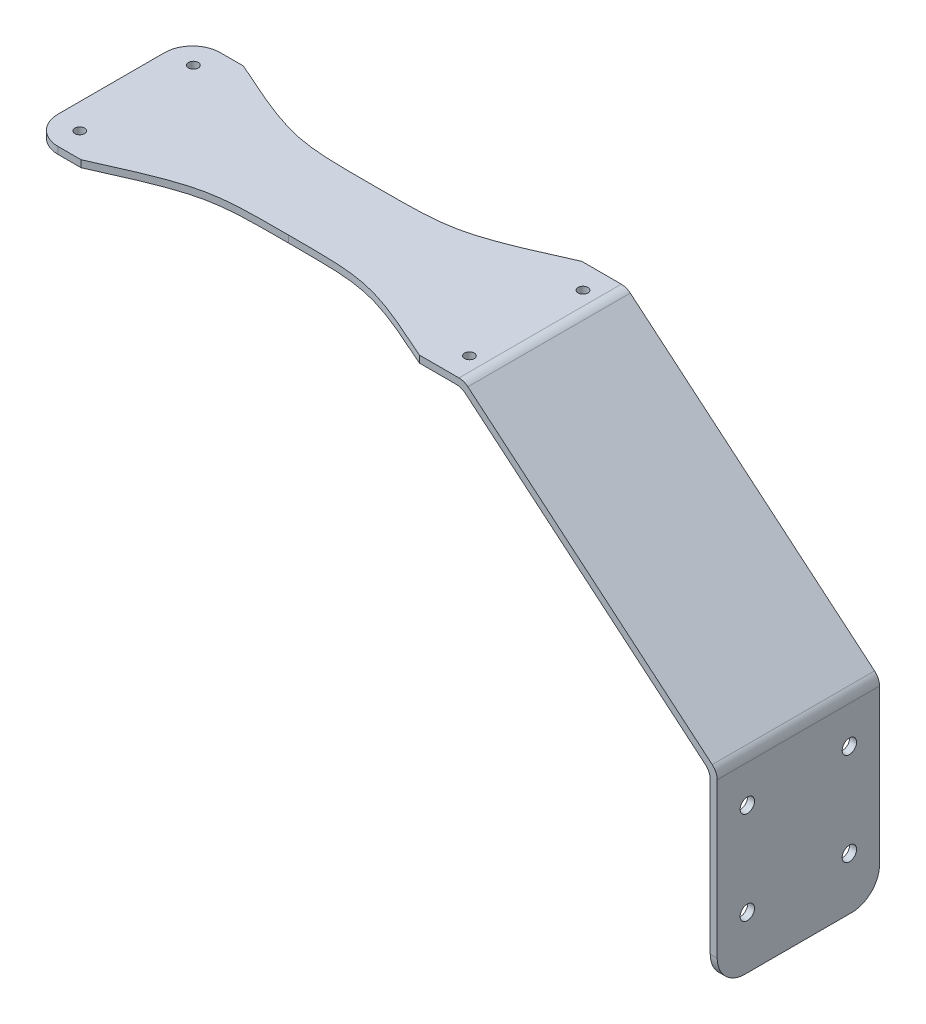
ISO-10303-21;
HEADER;
FILE_DESCRIPTION(('STEP AP214'),'2;1');
FILE_NAME('part.step','',(''),(''),'','','');
FILE_SCHEMA(('AUTOMOTIVE_DESIGN { 1 0 10303 214 1 1 1 1 }'));
ENDSEC;
DATA;
#1=APPLICATION_CONTEXT('core data for automotive mechanical design processes');
#2=APPLICATION_PROTOCOL_DEFINITION('international standard','automotive_design',2000,#1);
#3=PRODUCT_CONTEXT('',#1,'mechanical');
#4=PRODUCT('Part','Part','',(#3));
#5=PRODUCT_RELATED_PRODUCT_CATEGORY('part','',(#4));
#6=PRODUCT_DEFINITION_FORMATION('','',#4);
#7=PRODUCT_DEFINITION_CONTEXT('part definition',#1,'design');
#8=PRODUCT_DEFINITION('design','',#6,#7);
#9=PRODUCT_DEFINITION_SHAPE('','',#8);
#10=(LENGTH_UNIT() NAMED_UNIT(*) SI_UNIT(.MILLI.,.METRE.));
#11=(NAMED_UNIT(*) PLANE_ANGLE_UNIT() SI_UNIT($,.RADIAN.));
#12=(NAMED_UNIT(*) SI_UNIT($,.STERADIAN.) SOLID_ANGLE_UNIT());
#13=UNCERTAINTY_MEASURE_WITH_UNIT(LENGTH_MEASURE(1.E-05),#10,'distance_accuracy_value','');
#14=(GEOMETRIC_REPRESENTATION_CONTEXT(3) GLOBAL_UNCERTAINTY_ASSIGNED_CONTEXT((#13)) GLOBAL_UNIT_ASSIGNED_CONTEXT((#10,
#11,#12)) REPRESENTATION_CONTEXT('',''));
#15=CARTESIAN_POINT('',(0.,0.,0.));
#16=DIRECTION('',(0.,0.,1.));
#17=DIRECTION('',(1.,0.,0.));
#18=AXIS2_PLACEMENT_3D('',#15,#16,#17);
#19=CARTESIAN_POINT('',(-82.9491352286368,46.9727212743943,35.));
#20=DIRECTION('',(0.,-1.,0.));
#21=DIRECTION('',(1.,0.,0.));
#22=AXIS2_PLACEMENT_3D('',#19,#20,#21);
#23=PLANE('',#22);
#24=CARTESIAN_POINT('',(-77.4950905800361,46.9727212743943,5.25));
#25=DIRECTION('',(0.,1.,0.));
#26=DIRECTION('',(0.,0.,1.));
#27=AXIS2_PLACEMENT_3D('',#24,#25,#26);
#28=CIRCLE('',#27,1.05);
#29=CARTESIAN_POINT('',(-77.4950905800361,46.9727212743943,6.3));
#30=VERTEX_POINT('',#29);
#31=EDGE_CURVE('E487',#30,#30,#28,.T.);
#32=ORIENTED_EDGE('',*,*,#31,.F.);
#33=EDGE_LOOP('',(#32));
#34=FACE_BOUND('',#33,.T.);
#35=CARTESIAN_POINT('',(-77.4950905800361,46.9727212743943,29.75));
#36=DIRECTION('',(0.,1.,0.));
#37=DIRECTION('',(0.,0.,1.));
#38=AXIS2_PLACEMENT_3D('',#35,#36,#37);
#39=CIRCLE('',#38,1.05);
#40=CARTESIAN_POINT('',(-77.4950905800361,46.9727212743943,30.8));
#41=VERTEX_POINT('',#40);
#42=EDGE_CURVE('E481',#41,#41,#39,.T.);
#43=ORIENTED_EDGE('',*,*,#42,.F.);
#44=EDGE_LOOP('',(#43));
#45=FACE_BOUND('',#44,.T.);
#46=CARTESIAN_POINT('',(6.50490941996386,46.9727212743943,5.25));
#47=DIRECTION('',(0.,1.,0.));
#48=DIRECTION('',(0.,0.,1.));
#49=AXIS2_PLACEMENT_3D('',#46,#47,#48);
#50=CIRCLE('',#49,1.04999999999999);
#51=CARTESIAN_POINT('',(6.50490941996386,46.9727212743943,6.29999999999999));
#52=VERTEX_POINT('',#51);
#53=EDGE_CURVE('E475',#52,#52,#50,.T.);
#54=ORIENTED_EDGE('',*,*,#53,.F.);
#55=EDGE_LOOP('',(#54));
#56=FACE_BOUND('',#55,.T.);
#57=CARTESIAN_POINT('',(6.50490941996386,46.9727212743943,29.75));
#58=DIRECTION('',(0.,1.,0.));
#59=DIRECTION('',(0.,0.,1.));
#60=AXIS2_PLACEMENT_3D('',#57,#58,#59);
#61=CIRCLE('',#60,1.04999999999999);
#62=CARTESIAN_POINT('',(6.50490941996386,46.9727212743943,30.8));
#63=VERTEX_POINT('',#62);
#64=EDGE_CURVE('E469',#63,#63,#61,.T.);
#65=ORIENTED_EDGE('',*,*,#64,.F.);
#66=EDGE_LOOP('',(#65));
#67=FACE_BOUND('',#66,.T.);
#68=DIRECTION('',(0.,0.,-1.));
#69=VECTOR('',#68,1.);
#70=CARTESIAN_POINT('',(-82.9491352286368,46.9727212743943,35.));
#71=LINE('',#70,#69);
#72=CARTESIAN_POINT('',(-82.9491352286368,46.9727212743943,29.));
#73=VERTEX_POINT('',#72);
#74=CARTESIAN_POINT('',(-82.9491352286368,46.9727212743943,6.));
#75=VERTEX_POINT('',#74);
#76=EDGE_CURVE('E421',#73,#75,#71,.T.);
#77=ORIENTED_EDGE('',*,*,#76,.F.);
#78=CARTESIAN_POINT('',(-76.9491352286368,46.9727212743943,29.));
#79=DIRECTION('',(0.,-1.,0.));
#80=DIRECTION('',(1.,0.,0.));
#81=AXIS2_PLACEMENT_3D('',#78,#79,#80);
#82=CIRCLE('',#81,6.);
#83=CARTESIAN_POINT('',(-76.9491352286368,46.9727212743943,35.));
#84=VERTEX_POINT('',#83);
#85=EDGE_CURVE('E43',#73,#84,#82,.F.);
#86=ORIENTED_EDGE('',*,*,#85,.T.);
#87=DIRECTION('',(-1.,0.,0.));
#88=VECTOR('',#87,1.);
#89=CARTESIAN_POINT('',(-82.9491352286368,46.9727212743943,35.));
#90=LINE('',#89,#88);
#91=CARTESIAN_POINT('',(-71.981048338657,46.9727212743943,34.9999999994622));
#92=VERTEX_POINT('',#91);
#93=EDGE_CURVE('E208',#92,#84,#90,.T.);
#94=ORIENTED_EDGE('',*,*,#93,.F.);
#95=CARTESIAN_POINT('',(-77.4950905800361,46.9727212743943,37.5024454575796));
#96=CARTESIAN_POINT('',(-53.569935160438,46.9727212743943,26.6142980217504));
#97=CARTESIAN_POINT('',(-53.5142664198541,46.9727212743943,26.6999776009493));
#98=CARTESIAN_POINT('',(-35.4950905800361,46.9727212743943,26.6999776009493));
#99=B_SPLINE_CURVE_WITH_KNOTS('',3,(#95,#96,#97,#98),.UNSPECIFIED.,.F.,.F.,(4,4),(0.,1.),.UNSPECIFIED.);
#100=CARTESIAN_POINT('',(-35.4950905800362,46.9727212743943,26.6999776009493));
#101=VERTEX_POINT('',#100);
#102=EDGE_CURVE('E189',#92,#101,#99,.T.);
#103=ORIENTED_EDGE('',*,*,#102,.T.);
#104=CARTESIAN_POINT('',(6.50490941996383,46.9727212743943,37.5024454575796));
#105=CARTESIAN_POINT('',(-17.4202459996343,46.9727212743943,26.6142980217504));
#106=CARTESIAN_POINT('',(-17.4759147402182,46.9727212743943,26.6999776009493));
#107=CARTESIAN_POINT('',(-35.4950905800361,46.9727212743943,26.6999776009493));
#108=B_SPLINE_CURVE_WITH_KNOTS('',3,(#104,#105,#106,#107),.UNSPECIFIED.,.F.,.F.,(4,4),(0.,1.),.UNSPECIFIED.);
#109=CARTESIAN_POINT('',(0.990867178584706,46.9727212743943,34.9999999994622));
#110=VERTEX_POINT('',#109);
#111=EDGE_CURVE('E198',#110,#101,#108,.T.);
#112=ORIENTED_EDGE('',*,*,#111,.F.);
#113=CARTESIAN_POINT('',(9.50490941996389,46.9727212743943,35.));
#114=VERTEX_POINT('',#113);
#115=EDGE_CURVE('E463',#114,#110,#90,.T.);
#116=ORIENTED_EDGE('',*,*,#115,.F.);
#117=DIRECTION('',(0.,0.,-1.));
#118=VECTOR('',#117,1.);
#119=CARTESIAN_POINT('',(9.50490941996389,46.9727212743943,35.));
#120=LINE('',#119,#118);
#121=CARTESIAN_POINT('',(9.50490941996389,46.9727212743943,0.));
#122=VERTEX_POINT('',#121);
#123=EDGE_CURVE('E393',#114,#122,#120,.T.);
#124=ORIENTED_EDGE('',*,*,#123,.T.);
#125=DIRECTION('',(-1.,0.,0.));
#126=VECTOR('',#125,1.);
#127=CARTESIAN_POINT('',(-82.9491352286368,46.9727212743943,0.));
#128=LINE('',#127,#126);
#129=CARTESIAN_POINT('',(0.990867178584714,46.9727212743943,5.37825101294687E-10));
#130=VERTEX_POINT('',#129);
#131=EDGE_CURVE('E445',#122,#130,#128,.T.);
#132=ORIENTED_EDGE('',*,*,#131,.T.);
#133=CARTESIAN_POINT('',(6.50490941996383,46.9727212743943,-2.50244545757964));
#134=CARTESIAN_POINT('',(-17.4202459996343,46.9727212743943,8.38570197824956));
#135=CARTESIAN_POINT('',(-17.4759147402182,46.9727212743943,8.30002239905066));
#136=CARTESIAN_POINT('',(-35.4950905800361,46.9727212743943,8.30002239905066));
#137=B_SPLINE_CURVE_WITH_KNOTS('',3,(#133,#134,#135,#136),.UNSPECIFIED.,.F.,.F.,(4,4),(0.,1.),.UNSPECIFIED.);
#138=CARTESIAN_POINT('',(-35.4950905800362,46.9727212743943,8.30002239905066));
#139=VERTEX_POINT('',#138);
#140=EDGE_CURVE('E228',#130,#139,#137,.T.);
#141=ORIENTED_EDGE('',*,*,#140,.T.);
#142=CARTESIAN_POINT('',(-77.4950905800361,46.9727212743943,-2.50244545757964));
#143=CARTESIAN_POINT('',(-53.569935160438,46.9727212743943,8.38570197824956));
#144=CARTESIAN_POINT('',(-53.5142664198541,46.9727212743943,8.30002239905066));
#145=CARTESIAN_POINT('',(-35.4950905800361,46.9727212743943,8.30002239905066));
#146=B_SPLINE_CURVE_WITH_KNOTS('',3,(#142,#143,#144,#145),.UNSPECIFIED.,.F.,.F.,(4,4),(0.,1.),.UNSPECIFIED.);
#147=CARTESIAN_POINT('',(-71.981048338657,46.9727212743943,5.37825101294687E-10));
#148=VERTEX_POINT('',#147);
#149=EDGE_CURVE('E507',#148,#139,#146,.T.);
#150=ORIENTED_EDGE('',*,*,#149,.F.);
#151=CARTESIAN_POINT('',(-76.9491352286368,46.9727212743943,0.));
#152=VERTEX_POINT('',#151);
#153=EDGE_CURVE('E448',#148,#152,#128,.T.);
#154=ORIENTED_EDGE('',*,*,#153,.T.);
#155=CARTESIAN_POINT('',(-76.9491352286368,46.9727212743943,6.));
#156=DIRECTION('',(0.,-1.,0.));
#157=DIRECTION('',(1.,0.,0.));
#158=AXIS2_PLACEMENT_3D('',#155,#156,#157);
#159=CIRCLE('',#158,6.);
#160=EDGE_CURVE('E55',#152,#75,#159,.F.);
#161=ORIENTED_EDGE('',*,*,#160,.T.);
#162=EDGE_LOOP('',(#77,#86,#94,#103,#112,#116,#124,#132,#141,#150,#154,#161));
#163=FACE_BOUND('',#162,.T.);
#164=ADVANCED_FACE('F35',(#34,#45,#56,#67,#163),#23,.F.);
#165=CARTESIAN_POINT('',(10.0508647713632,45.4727212743943,35.));
#166=DIRECTION('',(0.,1.,0.));
#167=DIRECTION('',(-1.,0.,0.));
#168=AXIS2_PLACEMENT_3D('',#165,#166,#167);
#169=PLANE('',#168);
#170=CARTESIAN_POINT('',(-77.4950905800361,45.4727212743943,5.25));
#171=DIRECTION('',(0.,1.,0.));
#172=DIRECTION('',(-1.,0.,0.));
#173=AXIS2_PLACEMENT_3D('',#170,#171,#172);
#174=CIRCLE('',#173,1.05);
#175=CARTESIAN_POINT('',(-78.5450905800361,45.4727212743943,5.25));
#176=VERTEX_POINT('',#175);
#177=EDGE_CURVE('E484',#176,#176,#174,.T.);
#178=ORIENTED_EDGE('',*,*,#177,.T.);
#179=EDGE_LOOP('',(#178));
#180=FACE_BOUND('',#179,.T.);
#181=CARTESIAN_POINT('',(-77.4950905800361,45.4727212743943,29.75));
#182=DIRECTION('',(0.,1.,0.));
#183=DIRECTION('',(-1.,0.,0.));
#184=AXIS2_PLACEMENT_3D('',#181,#182,#183);
#185=CIRCLE('',#184,1.05);
#186=CARTESIAN_POINT('',(-78.5450905800361,45.4727212743943,29.75));
#187=VERTEX_POINT('',#186);
#188=EDGE_CURVE('E478',#187,#187,#185,.T.);
#189=ORIENTED_EDGE('',*,*,#188,.T.);
#190=EDGE_LOOP('',(#189));
#191=FACE_BOUND('',#190,.T.);
#192=CARTESIAN_POINT('',(6.50490941996386,45.4727212743943,5.25));
#193=DIRECTION('',(0.,1.,0.));
#194=DIRECTION('',(-1.,0.,0.));
#195=AXIS2_PLACEMENT_3D('',#192,#193,#194);
#196=CIRCLE('',#195,1.04999999999999);
#197=CARTESIAN_POINT('',(5.45490941996387,45.4727212743943,5.25));
#198=VERTEX_POINT('',#197);
#199=EDGE_CURVE('E472',#198,#198,#196,.T.);
#200=ORIENTED_EDGE('',*,*,#199,.T.);
#201=EDGE_LOOP('',(#200));
#202=FACE_BOUND('',#201,.T.);
#203=CARTESIAN_POINT('',(6.50490941996386,45.4727212743943,29.75));
#204=DIRECTION('',(0.,1.,0.));
#205=DIRECTION('',(-1.,0.,0.));
#206=AXIS2_PLACEMENT_3D('',#203,#204,#205);
#207=CIRCLE('',#206,1.04999999999999);
#208=CARTESIAN_POINT('',(5.45490941996387,45.4727212743943,29.75));
#209=VERTEX_POINT('',#208);
#210=EDGE_CURVE('E452',#209,#209,#207,.T.);
#211=ORIENTED_EDGE('',*,*,#210,.T.);
#212=EDGE_LOOP('',(#211));
#213=FACE_BOUND('',#212,.T.);
#214=DIRECTION('',(1.,0.,0.));
#215=VECTOR('',#214,1.);
#216=CARTESIAN_POINT('',(10.0508647713632,45.4727212743943,35.));
#217=LINE('',#216,#215);
#218=CARTESIAN_POINT('',(-76.9491352286368,45.4727212743943,35.));
#219=VERTEX_POINT('',#218);
#220=CARTESIAN_POINT('',(-71.9810483398484,45.4727212743943,35.));
#221=VERTEX_POINT('',#220);
#222=EDGE_CURVE('E460',#219,#221,#217,.T.);
#223=ORIENTED_EDGE('',*,*,#222,.F.);
#224=CARTESIAN_POINT('',(-76.9491352286368,45.4727212743943,29.));
#225=DIRECTION('',(0.,1.,0.));
#226=DIRECTION('',(-1.,0.,0.));
#227=AXIS2_PLACEMENT_3D('',#224,#225,#226);
#228=CIRCLE('',#227,6.);
#229=CARTESIAN_POINT('',(-82.9491352286368,45.4727212743943,29.));
#230=VERTEX_POINT('',#229);
#231=EDGE_CURVE('E350',#219,#230,#228,.F.);
#232=ORIENTED_EDGE('',*,*,#231,.T.);
#233=DIRECTION('',(0.,0.,-1.));
#234=VECTOR('',#233,1.);
#235=CARTESIAN_POINT('',(-82.9491352286368,45.4727212743943,35.));
#236=LINE('',#235,#234);
#237=CARTESIAN_POINT('',(-82.9491352286368,45.4727212743943,6.));
#238=VERTEX_POINT('',#237);
#239=EDGE_CURVE('E423',#230,#238,#236,.T.);
#240=ORIENTED_EDGE('',*,*,#239,.T.);
#241=CARTESIAN_POINT('',(-76.9491352286368,45.4727212743943,6.));
#242=DIRECTION('',(0.,1.,0.));
#243=DIRECTION('',(-1.,0.,0.));
#244=AXIS2_PLACEMENT_3D('',#241,#242,#243);
#245=CIRCLE('',#244,6.);
#246=CARTESIAN_POINT('',(-76.9491352286368,45.4727212743943,0.));
#247=VERTEX_POINT('',#246);
#248=EDGE_CURVE('E352',#238,#247,#245,.F.);
#249=ORIENTED_EDGE('',*,*,#248,.T.);
#250=DIRECTION('',(1.,0.,0.));
#251=VECTOR('',#250,1.);
#252=CARTESIAN_POINT('',(10.0508647713632,45.4727212743943,0.));
#253=LINE('',#252,#251);
#254=CARTESIAN_POINT('',(-71.9810483398484,45.4727212743943,0.));
#255=VERTEX_POINT('',#254);
#256=EDGE_CURVE('E442',#247,#255,#253,.T.);
#257=ORIENTED_EDGE('',*,*,#256,.T.);
#258=CARTESIAN_POINT('',(-77.4950905800361,45.4727212743943,-2.50244545757964));
#259=CARTESIAN_POINT('',(-53.569935160438,45.4727212743943,8.38570197824956));
#260=CARTESIAN_POINT('',(-53.5142664198541,45.4727212743943,8.30002239905066));
#261=CARTESIAN_POINT('',(-35.4950905800361,45.4727212743943,8.30002239905066));
#262=B_SPLINE_CURVE_WITH_KNOTS('',3,(#258,#259,#260,#261),.UNSPECIFIED.,.F.,.F.,(4,4),(0.,1.),.UNSPECIFIED.);
#263=CARTESIAN_POINT('',(-35.4950905800362,45.4727212743943,8.30002239905066));
#264=VERTEX_POINT('',#263);
#265=EDGE_CURVE('E494',#255,#264,#262,.T.);
#266=ORIENTED_EDGE('',*,*,#265,.T.);
#267=CARTESIAN_POINT('',(6.50490941996383,45.4727212743943,-2.50244545757964));
#268=CARTESIAN_POINT('',(-17.4202459996343,45.4727212743943,8.38570197824956));
#269=CARTESIAN_POINT('',(-17.4759147402182,45.4727212743943,8.30002239905066));
#270=CARTESIAN_POINT('',(-35.4950905800361,45.4727212743943,8.30002239905066));
#271=B_SPLINE_CURVE_WITH_KNOTS('',3,(#267,#268,#269,#270),.UNSPECIFIED.,.F.,.F.,(4,4),(0.,1.),.UNSPECIFIED.);
#272=CARTESIAN_POINT('',(0.990867179776089,45.4727212743943,0.));
#273=VERTEX_POINT('',#272);
#274=EDGE_CURVE('E490',#273,#264,#271,.T.);
#275=ORIENTED_EDGE('',*,*,#274,.F.);
#276=CARTESIAN_POINT('',(8.95895406856458,45.4727212743943,0.));
#277=VERTEX_POINT('',#276);
#278=EDGE_CURVE('E444',#273,#277,#253,.T.);
#279=ORIENTED_EDGE('',*,*,#278,.T.);
#280=DIRECTION('',(0.,0.,-1.));
#281=VECTOR('',#280,1.);
#282=CARTESIAN_POINT('',(8.95895406856458,45.4727212743943,35.));
#283=LINE('',#282,#281);
#284=CARTESIAN_POINT('',(8.95895406856458,45.4727212743943,35.));
#285=VERTEX_POINT('',#284);
#286=EDGE_CURVE('E390',#277,#285,#283,.F.);
#287=ORIENTED_EDGE('',*,*,#286,.T.);
#288=CARTESIAN_POINT('',(0.990867179776077,45.4727212743943,35.));
#289=VERTEX_POINT('',#288);
#290=EDGE_CURVE('E462',#289,#285,#217,.T.);
#291=ORIENTED_EDGE('',*,*,#290,.F.);
#292=CARTESIAN_POINT('',(6.50490941996383,45.4727212743943,37.5024454575796));
#293=CARTESIAN_POINT('',(-17.4202459996343,45.4727212743943,26.6142980217504));
#294=CARTESIAN_POINT('',(-17.4759147402182,45.4727212743943,26.6999776009493));
#295=CARTESIAN_POINT('',(-35.4950905800361,45.4727212743943,26.6999776009493));
#296=B_SPLINE_CURVE_WITH_KNOTS('',3,(#292,#293,#294,#295),.UNSPECIFIED.,.F.,.F.,(4,4),(0.,1.),.UNSPECIFIED.);
#297=CARTESIAN_POINT('',(-35.4950905800362,45.4727212743943,26.6999776009493));
#298=VERTEX_POINT('',#297);
#299=EDGE_CURVE('E195',#289,#298,#296,.T.);
#300=ORIENTED_EDGE('',*,*,#299,.T.);
#301=CARTESIAN_POINT('',(-77.4950905800361,45.4727212743943,37.5024454575796));
#302=CARTESIAN_POINT('',(-53.569935160438,45.4727212743943,26.6142980217504));
#303=CARTESIAN_POINT('',(-53.5142664198541,45.4727212743943,26.6999776009493));
#304=CARTESIAN_POINT('',(-35.4950905800361,45.4727212743943,26.6999776009493));
#305=B_SPLINE_CURVE_WITH_KNOTS('',3,(#301,#302,#303,#304),.UNSPECIFIED.,.F.,.F.,(4,4),(0.,1.),.UNSPECIFIED.);
#306=EDGE_CURVE('E192',#221,#298,#305,.T.);
#307=ORIENTED_EDGE('',*,*,#306,.F.);
#308=EDGE_LOOP('',(#223,#232,#240,#249,#257,#266,#275,#279,#287,#291,#300,#307));
#309=FACE_BOUND('',#308,.T.);
#310=ADVANCED_FACE('F295',(#180,#191,#202,#213,#309),#169,.F.);
#311=CARTESIAN_POINT('',(0.,0.,35.));
#312=DIRECTION('',(0.,0.,1.));
#313=DIRECTION('',(1.,0.,0.));
#314=AXIS2_PLACEMENT_3D('',#311,#312,#313);
#315=PLANE('',#314);
#316=ORIENTED_EDGE('',*,*,#93,.T.);
#317=DIRECTION('',(0.,-1.,0.));
#318=VECTOR('',#317,1.);
#319=CARTESIAN_POINT('',(-76.9491352286368,45.4727212743943,35.));
#320=LINE('',#319,#318);
#321=EDGE_CURVE('E343',#84,#219,#320,.T.);
#322=ORIENTED_EDGE('',*,*,#321,.T.);
#323=ORIENTED_EDGE('',*,*,#222,.T.);
#324=DIRECTION('',(0.,1.,0.));
#325=VECTOR('',#324,1.);
#326=CARTESIAN_POINT('',(-71.9810483398484,6.97272127439429,35.));
#327=LINE('',#326,#325);
#328=EDGE_CURVE('E373',#221,#92,#327,.T.);
#329=ORIENTED_EDGE('',*,*,#328,.T.);
#330=EDGE_LOOP('',(#316,#322,#323,#329));
#331=FACE_BOUND('',#330,.T.);
#332=ADVANCED_FACE('F274',(#331),#315,.T.);
#333=CARTESIAN_POINT('',(0.,0.,0.));
#334=DIRECTION('',(0.,0.,1.));
#335=DIRECTION('',(1.,0.,0.));
#336=AXIS2_PLACEMENT_3D('',#333,#334,#335);
#337=PLANE('',#336);
#338=DIRECTION('',(0.,1.,0.));
#339=VECTOR('',#338,1.);
#340=CARTESIAN_POINT('',(65.1739757896914,-39.5224114036637,0.));
#341=LINE('',#340,#339);
#342=CARTESIAN_POINT('',(65.1739757896914,-33.5224114036637,0.));
#343=VERTEX_POINT('',#342);
#344=CARTESIAN_POINT('',(65.1739757896915,-0.221872890896202,0.));
#345=VERTEX_POINT('',#344);
#346=EDGE_CURVE('E433',#343,#345,#341,.T.);
#347=ORIENTED_EDGE('',*,*,#346,.F.);
#348=DIRECTION('',(1.,0.,0.));
#349=VECTOR('',#348,1.);
#350=CARTESIAN_POINT('',(0.,-33.5224114036637,0.));
#351=LINE('',#350,#349);
#352=CARTESIAN_POINT('',(63.6739757896914,-33.5224114036637,0.));
#353=VERTEX_POINT('',#352);
#354=EDGE_CURVE('E355',#343,#353,#351,.F.);
#355=ORIENTED_EDGE('',*,*,#354,.T.);
#356=DIRECTION('',(0.,-1.,0.));
#357=VECTOR('',#356,1.);
#358=CARTESIAN_POINT('',(63.6739757896914,0.477588596336311,0.));
#359=LINE('',#358,#357);
#360=CARTESIAN_POINT('',(63.6739757896914,-0.921334378128675,0.));
#361=VERTEX_POINT('',#360);
#362=EDGE_CURVE('E436',#361,#353,#359,.T.);
#363=ORIENTED_EDGE('',*,*,#362,.F.);
#364=CARTESIAN_POINT('',(60.6739757896914,-0.921334378128674,0.));
#365=DIRECTION('',(0.,0.,1.));
#366=DIRECTION('',(1.,0.,0.));
#367=AXIS2_PLACEMENT_3D('',#364,#365,#366);
#368=CIRCLE('',#367,3.);
#369=CARTESIAN_POINT('',(62.6023386187511,1.37679895122825,0.));
#370=VERTEX_POINT('',#369);
#371=EDGE_CURVE('E388',#361,#370,#368,.T.);
#372=ORIENTED_EDGE('',*,*,#371,.T.);
#373=DIRECTION('',(0.766044443118975,-0.642787609686543,0.));
#374=VECTOR('',#373,1.);
#375=CARTESIAN_POINT('',(63.6739757896914,0.477588596336311,0.));
#376=LINE('',#375,#374);
#377=CARTESIAN_POINT('',(10.8873168976242,44.7708546037512,0.));
#378=VERTEX_POINT('',#377);
#379=EDGE_CURVE('E439',#378,#370,#376,.T.);
#380=ORIENTED_EDGE('',*,*,#379,.F.);
#381=CARTESIAN_POINT('',(8.95895406856458,42.4727212743943,0.));
#382=DIRECTION('',(0.,0.,1.));
#383=DIRECTION('',(1.,0.,0.));
#384=AXIS2_PLACEMENT_3D('',#381,#382,#383);
#385=CIRCLE('',#384,3.);
#386=EDGE_CURVE('E383',#378,#277,#385,.T.);
#387=ORIENTED_EDGE('',*,*,#386,.T.);
#388=ORIENTED_EDGE('',*,*,#278,.F.);
#389=DIRECTION('',(0.,1.,0.));
#390=VECTOR('',#389,1.);
#391=CARTESIAN_POINT('',(0.990867179776092,6.97272127439431,0.));
#392=LINE('',#391,#390);
#393=EDGE_CURVE('E376',#130,#273,#392,.F.);
#394=ORIENTED_EDGE('',*,*,#393,.F.);
#395=ORIENTED_EDGE('',*,*,#131,.F.);
#396=CARTESIAN_POINT('',(9.50490941996389,43.9727212743943,0.));
#397=DIRECTION('',(0.,0.,1.));
#398=DIRECTION('',(1.,0.,0.));
#399=AXIS2_PLACEMENT_3D('',#396,#397,#398);
#400=CIRCLE('',#399,3.);
#401=CARTESIAN_POINT('',(11.4332722490235,46.2708546037512,0.));
#402=VERTEX_POINT('',#401);
#403=EDGE_CURVE('E406',#122,#402,#400,.F.);
#404=ORIENTED_EDGE('',*,*,#403,.T.);
#405=DIRECTION('',(-0.766044443118975,0.642787609686543,0.));
#406=VECTOR('',#405,1.);
#407=CARTESIAN_POINT('',(10.5968201227625,46.9727212743943,0.));
#408=LINE('',#407,#406);
#409=CARTESIAN_POINT('',(64.1023386187511,2.07626043846072,0.));
#410=VERTEX_POINT('',#409);
#411=EDGE_CURVE('E449',#410,#402,#408,.T.);
#412=ORIENTED_EDGE('',*,*,#411,.F.);
#413=CARTESIAN_POINT('',(62.1739757896915,-0.221872890896202,0.));
#414=DIRECTION('',(0.,0.,1.));
#415=DIRECTION('',(1.,0.,0.));
#416=AXIS2_PLACEMENT_3D('',#413,#414,#415);
#417=CIRCLE('',#416,3.);
#418=EDGE_CURVE('E403',#410,#345,#417,.F.);
#419=ORIENTED_EDGE('',*,*,#418,.T.);
#420=EDGE_LOOP('',(#347,#355,#363,#372,#380,#387,#388,#394,#395,#404,#412,#419));
#421=FACE_BOUND('',#420,.T.);
#422=ADVANCED_FACE('F278',(#421),#337,.F.);
#423=CARTESIAN_POINT('',(10.5968201227625,46.9727212743943,35.));
#424=DIRECTION('',(-0.642787609686543,-0.766044443118975,0.));
#425=DIRECTION('',(0.766044443118975,-0.642787609686543,0.));
#426=AXIS2_PLACEMENT_3D('',#423,#424,#425);
#427=PLANE('',#426);
#428=DIRECTION('',(-0.766044443118975,0.642787609686543,0.));
#429=VECTOR('',#428,1.);
#430=CARTESIAN_POINT('',(10.5968201227625,46.9727212743943,35.));
#431=LINE('',#430,#429);
#432=CARTESIAN_POINT('',(64.1023386187511,2.07626043846072,35.));
#433=VERTEX_POINT('',#432);
#434=CARTESIAN_POINT('',(11.4332722490235,46.2708546037512,35.));
#435=VERTEX_POINT('',#434);
#436=EDGE_CURVE('E435',#433,#435,#431,.T.);
#437=ORIENTED_EDGE('',*,*,#436,.F.);
#438=DIRECTION('',(0.,0.,-1.));
#439=VECTOR('',#438,1.);
#440=CARTESIAN_POINT('',(64.1023386187511,2.07626043846072,35.));
#441=LINE('',#440,#439);
#442=EDGE_CURVE('E408',#433,#410,#441,.T.);
#443=ORIENTED_EDGE('',*,*,#442,.T.);
#444=ORIENTED_EDGE('',*,*,#411,.T.);
#445=DIRECTION('',(0.,0.,-1.));
#446=VECTOR('',#445,1.);
#447=CARTESIAN_POINT('',(11.4332722490235,46.2708546037512,35.));
#448=LINE('',#447,#446);
#449=EDGE_CURVE('E411',#402,#435,#448,.F.);
#450=ORIENTED_EDGE('',*,*,#449,.T.);
#451=EDGE_LOOP('',(#437,#443,#444,#450));
#452=FACE_BOUND('',#451,.T.);
#453=ADVANCED_FACE('F301',(#452),#427,.F.);
#454=CARTESIAN_POINT('',(-82.9491352286368,45.4727212743943,35.));
#455=DIRECTION('',(1.,0.,0.));
#456=DIRECTION('',(0.,0.,-1.));
#457=AXIS2_PLACEMENT_3D('',#454,#455,#456);
#458=PLANE('',#457);
#459=ORIENTED_EDGE('',*,*,#239,.F.);
#460=DIRECTION('',(0.,-1.,0.));
#461=VECTOR('',#460,1.);
#462=CARTESIAN_POINT('',(-82.9491352286368,46.9727212743943,29.));
#463=LINE('',#462,#461);
#464=EDGE_CURVE('E341',#230,#73,#463,.F.);
#465=ORIENTED_EDGE('',*,*,#464,.T.);
#466=ORIENTED_EDGE('',*,*,#76,.T.);
#467=DIRECTION('',(0.,-1.,0.));
#468=VECTOR('',#467,1.);
#469=CARTESIAN_POINT('',(-82.9491352286368,45.4727212743943,6.));
#470=LINE('',#469,#468);
#471=EDGE_CURVE('E347',#75,#238,#470,.T.);
#472=ORIENTED_EDGE('',*,*,#471,.T.);
#473=EDGE_LOOP('',(#459,#465,#466,#472));
#474=FACE_BOUND('',#473,.T.);
#475=ADVANCED_FACE('F293',(#474),#458,.F.);
#476=CARTESIAN_POINT('',(63.6739757896914,0.477588596336311,35.));
#477=DIRECTION('',(0.642787609686543,0.766044443118975,0.));
#478=DIRECTION('',(-0.766044443118975,0.642787609686543,0.));
#479=AXIS2_PLACEMENT_3D('',#476,#477,#478);
#480=PLANE('',#479);
#481=ORIENTED_EDGE('',*,*,#379,.T.);
#482=DIRECTION('',(0.,0.,-1.));
#483=VECTOR('',#482,1.);
#484=CARTESIAN_POINT('',(62.6023386187511,1.37679895122825,35.));
#485=LINE('',#484,#483);
#486=CARTESIAN_POINT('',(62.6023386187511,1.37679895122825,35.));
#487=VERTEX_POINT('',#486);
#488=EDGE_CURVE('E413',#370,#487,#485,.F.);
#489=ORIENTED_EDGE('',*,*,#488,.T.);
#490=DIRECTION('',(0.766044443118975,-0.642787609686543,0.));
#491=VECTOR('',#490,1.);
#492=CARTESIAN_POINT('',(63.6739757896914,0.477588596336311,35.));
#493=LINE('',#492,#491);
#494=CARTESIAN_POINT('',(10.8873168976242,44.7708546037512,35.));
#495=VERTEX_POINT('',#494);
#496=EDGE_CURVE('E457',#495,#487,#493,.T.);
#497=ORIENTED_EDGE('',*,*,#496,.F.);
#498=DIRECTION('',(0.,0.,-1.));
#499=VECTOR('',#498,1.);
#500=CARTESIAN_POINT('',(10.8873168976242,44.7708546037512,0.));
#501=LINE('',#500,#499);
#502=EDGE_CURVE('E415',#495,#378,#501,.T.);
#503=ORIENTED_EDGE('',*,*,#502,.T.);
#504=EDGE_LOOP('',(#481,#489,#497,#503));
#505=FACE_BOUND('',#504,.T.);
#506=ADVANCED_FACE('F289',(#505),#480,.F.);
#507=CARTESIAN_POINT('',(63.6739757896914,0.477588596336311,35.));
#508=DIRECTION('',(1.,0.,0.));
#509=DIRECTION('',(0.,1.,0.));
#510=AXIS2_PLACEMENT_3D('',#507,#508,#509);
#511=PLANE('',#510);
#512=CARTESIAN_POINT('',(63.6739757896914,-8.22187289089621,28.5));
#513=DIRECTION('',(1.,0.,0.));
#514=DIRECTION('',(0.,1.,0.));
#515=AXIS2_PLACEMENT_3D('',#512,#513,#514);
#516=CIRCLE('',#515,1.55);
#517=CARTESIAN_POINT('',(63.6739757896914,-6.67187289089621,28.5));
#518=VERTEX_POINT('',#517);
#519=EDGE_CURVE('E809',#518,#518,#516,.T.);
#520=ORIENTED_EDGE('',*,*,#519,.T.);
#521=EDGE_LOOP('',(#520));
#522=FACE_BOUND('',#521,.T.);
#523=CARTESIAN_POINT('',(63.6739757896914,-8.22187289089621,6.5));
#524=DIRECTION('',(1.,0.,0.));
#525=DIRECTION('',(0.,1.,0.));
#526=AXIS2_PLACEMENT_3D('',#523,#524,#525);
#527=CIRCLE('',#526,1.55);
#528=CARTESIAN_POINT('',(63.6739757896914,-6.67187289089621,6.5));
#529=VERTEX_POINT('',#528);
#530=EDGE_CURVE('E803',#529,#529,#527,.T.);
#531=ORIENTED_EDGE('',*,*,#530,.T.);
#532=EDGE_LOOP('',(#531));
#533=FACE_BOUND('',#532,.T.);
#534=CARTESIAN_POINT('',(63.6739757896914,-28.2218728908962,6.5));
#535=DIRECTION('',(1.,0.,0.));
#536=DIRECTION('',(0.,1.,0.));
#537=AXIS2_PLACEMENT_3D('',#534,#535,#536);
#538=CIRCLE('',#537,1.55);
#539=CARTESIAN_POINT('',(63.6739757896914,-26.6718728908962,6.5));
#540=VERTEX_POINT('',#539);
#541=EDGE_CURVE('E797',#540,#540,#538,.T.);
#542=ORIENTED_EDGE('',*,*,#541,.T.);
#543=EDGE_LOOP('',(#542));
#544=FACE_BOUND('',#543,.T.);
#545=CARTESIAN_POINT('',(63.6739757896914,-28.2218728908962,28.5));
#546=DIRECTION('',(1.,0.,0.));
#547=DIRECTION('',(0.,1.,0.));
#548=AXIS2_PLACEMENT_3D('',#545,#546,#547);
#549=CIRCLE('',#548,1.55);
#550=CARTESIAN_POINT('',(63.6739757896914,-26.6718728908962,28.5));
#551=VERTEX_POINT('',#550);
#552=EDGE_CURVE('E204',#551,#551,#549,.T.);
#553=ORIENTED_EDGE('',*,*,#552,.T.);
#554=EDGE_LOOP('',(#553));
#555=FACE_BOUND('',#554,.T.);
#556=DIRECTION('',(0.,0.,-1.));
#557=VECTOR('',#556,1.);
#558=CARTESIAN_POINT('',(63.6739757896914,-39.5224114036637,35.));
#559=LINE('',#558,#557);
#560=CARTESIAN_POINT('',(63.6739757896914,-39.5224114036637,29.));
#561=VERTEX_POINT('',#560);
#562=CARTESIAN_POINT('',(63.6739757896914,-39.5224114036637,6.));
#563=VERTEX_POINT('',#562);
#564=EDGE_CURVE('E426',#561,#563,#559,.T.);
#565=ORIENTED_EDGE('',*,*,#564,.F.);
#566=CARTESIAN_POINT('',(63.6739757896914,-33.5224114036637,29.));
#567=DIRECTION('',(1.,0.,0.));
#568=DIRECTION('',(0.,1.,0.));
#569=AXIS2_PLACEMENT_3D('',#566,#567,#568);
#570=CIRCLE('',#569,6.);
#571=CARTESIAN_POINT('',(63.6739757896914,-33.5224114036637,35.));
#572=VERTEX_POINT('',#571);
#573=EDGE_CURVE('E357',#561,#572,#570,.F.);
#574=ORIENTED_EDGE('',*,*,#573,.T.);
#575=DIRECTION('',(0.,-1.,0.));
#576=VECTOR('',#575,1.);
#577=CARTESIAN_POINT('',(63.6739757896914,0.477588596336311,35.));
#578=LINE('',#577,#576);
#579=CARTESIAN_POINT('',(63.6739757896914,-0.921334378128675,35.));
#580=VERTEX_POINT('',#579);
#581=EDGE_CURVE('E454',#580,#572,#578,.T.);
#582=ORIENTED_EDGE('',*,*,#581,.F.);
#583=DIRECTION('',(0.,0.,-1.));
#584=VECTOR('',#583,1.);
#585=CARTESIAN_POINT('',(63.6739757896914,-0.921334378128675,0.));
#586=LINE('',#585,#584);
#587=EDGE_CURVE('E418',#580,#361,#586,.T.);
#588=ORIENTED_EDGE('',*,*,#587,.T.);
#589=ORIENTED_EDGE('',*,*,#362,.T.);
#590=CARTESIAN_POINT('',(63.6739757896914,-33.5224114036637,6.));
#591=DIRECTION('',(1.,0.,0.));
#592=DIRECTION('',(0.,1.,0.));
#593=AXIS2_PLACEMENT_3D('',#590,#591,#592);
#594=CIRCLE('',#593,6.);
#595=EDGE_CURVE('E359',#353,#563,#594,.F.);
#596=ORIENTED_EDGE('',*,*,#595,.T.);
#597=EDGE_LOOP('',(#565,#574,#582,#588,#589,#596));
#598=FACE_BOUND('',#597,.T.);
#599=ADVANCED_FACE('F285',(#522,#533,#544,#555,#598),#511,.F.);
#600=CARTESIAN_POINT('',(63.6739757896914,-39.5224114036637,35.));
#601=DIRECTION('',(0.,1.,0.));
#602=DIRECTION('',(0.,0.,1.));
#603=AXIS2_PLACEMENT_3D('',#600,#601,#602);
#604=PLANE('',#603);
#605=DIRECTION('',(0.,0.,-1.));
#606=VECTOR('',#605,1.);
#607=CARTESIAN_POINT('',(65.1739757896914,-39.5224114036637,35.));
#608=LINE('',#607,#606);
#609=CARTESIAN_POINT('',(65.1739757896914,-39.5224114036637,29.));
#610=VERTEX_POINT('',#609);
#611=CARTESIAN_POINT('',(65.1739757896914,-39.5224114036637,6.));
#612=VERTEX_POINT('',#611);
#613=EDGE_CURVE('E429',#610,#612,#608,.T.);
#614=ORIENTED_EDGE('',*,*,#613,.F.);
#615=DIRECTION('',(1.,0.,0.));
#616=VECTOR('',#615,1.);
#617=CARTESIAN_POINT('',(63.6739757896914,-39.5224114036637,29.));
#618=LINE('',#617,#616);
#619=EDGE_CURVE('E361',#610,#561,#618,.F.);
#620=ORIENTED_EDGE('',*,*,#619,.T.);
#621=ORIENTED_EDGE('',*,*,#564,.T.);
#622=DIRECTION('',(1.,0.,0.));
#623=VECTOR('',#622,1.);
#624=CARTESIAN_POINT('',(63.6739757896914,-39.5224114036637,6.));
#625=LINE('',#624,#623);
#626=EDGE_CURVE('E363',#563,#612,#625,.T.);
#627=ORIENTED_EDGE('',*,*,#626,.T.);
#628=EDGE_LOOP('',(#614,#620,#621,#627));
#629=FACE_BOUND('',#628,.T.);
#630=ADVANCED_FACE('F281',(#629),#604,.F.);
#631=CARTESIAN_POINT('',(65.1739757896914,-39.5224114036637,35.));
#632=DIRECTION('',(-1.,0.,0.));
#633=DIRECTION('',(0.,-1.,0.));
#634=AXIS2_PLACEMENT_3D('',#631,#632,#633);
#635=PLANE('',#634);
#636=CARTESIAN_POINT('',(65.1739757896915,-8.22187289089621,28.5));
#637=DIRECTION('',(1.,0.,0.));
#638=DIRECTION('',(0.,0.,-1.));
#639=AXIS2_PLACEMENT_3D('',#636,#637,#638);
#640=CIRCLE('',#639,1.55);
#641=CARTESIAN_POINT('',(65.1739757896915,-8.22187289089621,26.95));
#642=VERTEX_POINT('',#641);
#643=EDGE_CURVE('E812',#642,#642,#640,.T.);
#644=ORIENTED_EDGE('',*,*,#643,.F.);
#645=EDGE_LOOP('',(#644));
#646=FACE_BOUND('',#645,.T.);
#647=CARTESIAN_POINT('',(65.1739757896915,-8.22187289089621,6.5));
#648=DIRECTION('',(1.,0.,0.));
#649=DIRECTION('',(0.,0.,-1.));
#650=AXIS2_PLACEMENT_3D('',#647,#648,#649);
#651=CIRCLE('',#650,1.55);
#652=CARTESIAN_POINT('',(65.1739757896915,-8.22187289089621,4.95));
#653=VERTEX_POINT('',#652);
#654=EDGE_CURVE('E806',#653,#653,#651,.T.);
#655=ORIENTED_EDGE('',*,*,#654,.F.);
#656=EDGE_LOOP('',(#655));
#657=FACE_BOUND('',#656,.T.);
#658=CARTESIAN_POINT('',(65.1739757896915,-28.2218728908962,6.5));
#659=DIRECTION('',(1.,0.,0.));
#660=DIRECTION('',(0.,0.,-1.));
#661=AXIS2_PLACEMENT_3D('',#658,#659,#660);
#662=CIRCLE('',#661,1.55);
#663=CARTESIAN_POINT('',(65.1739757896915,-28.2218728908962,4.95));
#664=VERTEX_POINT('',#663);
#665=EDGE_CURVE('E800',#664,#664,#662,.T.);
#666=ORIENTED_EDGE('',*,*,#665,.F.);
#667=EDGE_LOOP('',(#666));
#668=FACE_BOUND('',#667,.T.);
#669=CARTESIAN_POINT('',(65.1739757896915,-28.2218728908962,28.5));
#670=DIRECTION('',(1.,0.,0.));
#671=DIRECTION('',(0.,0.,-1.));
#672=AXIS2_PLACEMENT_3D('',#669,#670,#671);
#673=CIRCLE('',#672,1.55);
#674=CARTESIAN_POINT('',(65.1739757896915,-28.2218728908962,26.95));
#675=VERTEX_POINT('',#674);
#676=EDGE_CURVE('E794',#675,#675,#673,.T.);
#677=ORIENTED_EDGE('',*,*,#676,.F.);
#678=EDGE_LOOP('',(#677));
#679=FACE_BOUND('',#678,.T.);
#680=DIRECTION('',(0.,1.,0.));
#681=VECTOR('',#680,1.);
#682=CARTESIAN_POINT('',(65.1739757896914,-39.5224114036637,35.));
#683=LINE('',#682,#681);
#684=CARTESIAN_POINT('',(65.1739757896914,-33.5224114036637,35.));
#685=VERTEX_POINT('',#684);
#686=CARTESIAN_POINT('',(65.1739757896915,-0.221872890896202,35.));
#687=VERTEX_POINT('',#686);
#688=EDGE_CURVE('E432',#685,#687,#683,.T.);
#689=ORIENTED_EDGE('',*,*,#688,.F.);
#690=CARTESIAN_POINT('',(65.1739757896914,-33.5224114036637,29.));
#691=DIRECTION('',(-1.,0.,0.));
#692=DIRECTION('',(0.,-1.,0.));
#693=AXIS2_PLACEMENT_3D('',#690,#691,#692);
#694=CIRCLE('',#693,6.);
#695=EDGE_CURVE('E366',#685,#610,#694,.F.);
#696=ORIENTED_EDGE('',*,*,#695,.T.);
#697=ORIENTED_EDGE('',*,*,#613,.T.);
#698=CARTESIAN_POINT('',(65.1739757896914,-33.5224114036637,6.));
#699=DIRECTION('',(-1.,0.,0.));
#700=DIRECTION('',(0.,-1.,0.));
#701=AXIS2_PLACEMENT_3D('',#698,#699,#700);
#702=CIRCLE('',#701,6.);
#703=EDGE_CURVE('E368',#612,#343,#702,.F.);
#704=ORIENTED_EDGE('',*,*,#703,.T.);
#705=ORIENTED_EDGE('',*,*,#346,.T.);
#706=DIRECTION('',(0.,0.,-1.));
#707=VECTOR('',#706,1.);
#708=CARTESIAN_POINT('',(65.1739757896915,-0.221872890896202,35.));
#709=LINE('',#708,#707);
#710=EDGE_CURVE('E400',#345,#687,#709,.F.);
#711=ORIENTED_EDGE('',*,*,#710,.T.);
#712=EDGE_LOOP('',(#689,#696,#697,#704,#705,#711));
#713=FACE_BOUND('',#712,.T.);
#714=ADVANCED_FACE('F272',(#646,#657,#668,#679,#713),#635,.F.);
#715=ORIENTED_EDGE('',*,*,#581,.T.);
#716=DIRECTION('',(1.,0.,0.));
#717=VECTOR('',#716,1.);
#718=CARTESIAN_POINT('',(65.1739757896914,-33.5224114036637,35.));
#719=LINE('',#718,#717);
#720=EDGE_CURVE('E370',#572,#685,#719,.T.);
#721=ORIENTED_EDGE('',*,*,#720,.T.);
#722=ORIENTED_EDGE('',*,*,#688,.T.);
#723=CARTESIAN_POINT('',(62.1739757896915,-0.221872890896202,35.));
#724=DIRECTION('',(0.,0.,1.));
#725=DIRECTION('',(1.,0.,0.));
#726=AXIS2_PLACEMENT_3D('',#723,#724,#725);
#727=CIRCLE('',#726,3.);
#728=EDGE_CURVE('E396',#687,#433,#727,.T.);
#729=ORIENTED_EDGE('',*,*,#728,.T.);
#730=ORIENTED_EDGE('',*,*,#436,.T.);
#731=CARTESIAN_POINT('',(9.50490941996389,43.9727212743943,35.));
#732=DIRECTION('',(0.,0.,1.));
#733=DIRECTION('',(1.,0.,0.));
#734=AXIS2_PLACEMENT_3D('',#731,#732,#733);
#735=CIRCLE('',#734,3.);
#736=EDGE_CURVE('E398',#435,#114,#735,.T.);
#737=ORIENTED_EDGE('',*,*,#736,.T.);
#738=ORIENTED_EDGE('',*,*,#115,.T.);
#739=DIRECTION('',(0.,1.,0.));
#740=VECTOR('',#739,1.);
#741=CARTESIAN_POINT('',(0.990867179776075,6.97272127439431,35.));
#742=LINE('',#741,#740);
#743=EDGE_CURVE('E201',#289,#110,#742,.T.);
#744=ORIENTED_EDGE('',*,*,#743,.F.);
#745=ORIENTED_EDGE('',*,*,#290,.T.);
#746=CARTESIAN_POINT('',(8.95895406856458,42.4727212743943,35.));
#747=DIRECTION('',(0.,0.,1.));
#748=DIRECTION('',(1.,0.,0.));
#749=AXIS2_PLACEMENT_3D('',#746,#747,#748);
#750=CIRCLE('',#749,3.);
#751=EDGE_CURVE('E381',#285,#495,#750,.F.);
#752=ORIENTED_EDGE('',*,*,#751,.T.);
#753=ORIENTED_EDGE('',*,*,#496,.T.);
#754=CARTESIAN_POINT('',(60.6739757896914,-0.921334378128674,35.));
#755=DIRECTION('',(0.,0.,1.));
#756=DIRECTION('',(1.,0.,0.));
#757=AXIS2_PLACEMENT_3D('',#754,#755,#756);
#758=CIRCLE('',#757,3.);
#759=EDGE_CURVE('E386',#487,#580,#758,.F.);
#760=ORIENTED_EDGE('',*,*,#759,.T.);
#761=EDGE_LOOP('',(#715,#721,#722,#729,#730,#737,#738,#744,#745,#752,#753,#760));
#762=FACE_BOUND('',#761,.T.);
#763=ADVANCED_FACE('F268',(#762),#315,.T.);
#764=ORIENTED_EDGE('',*,*,#256,.F.);
#765=DIRECTION('',(0.,-1.,0.));
#766=VECTOR('',#765,1.);
#767=CARTESIAN_POINT('',(-76.9491352286368,0.,0.));
#768=LINE('',#767,#766);
#769=EDGE_CURVE('E11',#247,#152,#768,.F.);
#770=ORIENTED_EDGE('',*,*,#769,.T.);
#771=ORIENTED_EDGE('',*,*,#153,.F.);
#772=DIRECTION('',(0.,1.,0.));
#773=VECTOR('',#772,1.);
#774=CARTESIAN_POINT('',(-71.9810483398484,6.97272127439429,0.));
#775=LINE('',#774,#773);
#776=EDGE_CURVE('E378',#148,#255,#775,.F.);
#777=ORIENTED_EDGE('',*,*,#776,.T.);
#778=EDGE_LOOP('',(#764,#770,#771,#777));
#779=FACE_BOUND('',#778,.T.);
#780=ADVANCED_FACE('F271',(#779),#337,.F.);
#781=CARTESIAN_POINT('',(60.6739757896914,-0.921334378128674,35.));
#782=DIRECTION('',(0.,0.,1.));
#783=DIRECTION('',(1.,0.,0.));
#784=AXIS2_PLACEMENT_3D('',#781,#782,#783);
#785=CYLINDRICAL_SURFACE('',#784,3.);
#786=ORIENTED_EDGE('',*,*,#759,.F.);
#787=ORIENTED_EDGE('',*,*,#488,.F.);
#788=ORIENTED_EDGE('',*,*,#371,.F.);
#789=ORIENTED_EDGE('',*,*,#587,.F.);
#790=EDGE_LOOP('',(#786,#787,#788,#789));
#791=FACE_BOUND('',#790,.T.);
#792=ADVANCED_FACE('F277',(#791),#785,.F.);
#793=CARTESIAN_POINT('',(62.1739757896915,-0.221872890896202,35.));
#794=DIRECTION('',(0.,0.,-1.));
#795=DIRECTION('',(-1.,0.,0.));
#796=AXIS2_PLACEMENT_3D('',#793,#794,#795);
#797=CYLINDRICAL_SURFACE('',#796,3.);
#798=ORIENTED_EDGE('',*,*,#728,.F.);
#799=ORIENTED_EDGE('',*,*,#710,.F.);
#800=ORIENTED_EDGE('',*,*,#418,.F.);
#801=ORIENTED_EDGE('',*,*,#442,.F.);
#802=EDGE_LOOP('',(#798,#799,#800,#801));
#803=FACE_BOUND('',#802,.T.);
#804=ADVANCED_FACE('F311',(#803),#797,.T.);
#805=CARTESIAN_POINT('',(9.50490941996389,43.9727212743943,35.));
#806=DIRECTION('',(0.,0.,-1.));
#807=DIRECTION('',(-1.,0.,0.));
#808=AXIS2_PLACEMENT_3D('',#805,#806,#807);
#809=CYLINDRICAL_SURFACE('',#808,3.);
#810=ORIENTED_EDGE('',*,*,#736,.F.);
#811=ORIENTED_EDGE('',*,*,#449,.F.);
#812=ORIENTED_EDGE('',*,*,#403,.F.);
#813=ORIENTED_EDGE('',*,*,#123,.F.);
#814=EDGE_LOOP('',(#810,#811,#812,#813));
#815=FACE_BOUND('',#814,.T.);
#816=ADVANCED_FACE('F315',(#815),#809,.T.);
#817=CARTESIAN_POINT('',(8.95895406856458,42.4727212743943,35.));
#818=DIRECTION('',(0.,0.,1.));
#819=DIRECTION('',(1.,0.,0.));
#820=AXIS2_PLACEMENT_3D('',#817,#818,#819);
#821=CYLINDRICAL_SURFACE('',#820,3.);
#822=ORIENTED_EDGE('',*,*,#751,.F.);
#823=ORIENTED_EDGE('',*,*,#286,.F.);
#824=ORIENTED_EDGE('',*,*,#386,.F.);
#825=ORIENTED_EDGE('',*,*,#502,.F.);
#826=EDGE_LOOP('',(#822,#823,#824,#825));
#827=FACE_BOUND('',#826,.T.);
#828=ADVANCED_FACE('F266',(#827),#821,.F.);
#829=CARTESIAN_POINT('',(6.50490941996386,46.9727212743943,29.75));
#830=DIRECTION('',(0.,1.,0.));
#831=DIRECTION('',(0.,0.,1.));
#832=AXIS2_PLACEMENT_3D('',#829,#830,#831);
#833=CYLINDRICAL_SURFACE('',#832,1.04999999999999);
#834=ORIENTED_EDGE('',*,*,#210,.F.);
#835=EDGE_LOOP('',(#834));
#836=FACE_BOUND('',#835,.T.);
#837=ORIENTED_EDGE('',*,*,#64,.T.);
#838=EDGE_LOOP('',(#837));
#839=FACE_BOUND('',#838,.T.);
#840=ADVANCED_FACE('F262',(#836,#839),#833,.F.);
#841=CARTESIAN_POINT('',(6.50490941996386,46.9727212743943,5.25));
#842=DIRECTION('',(0.,1.,0.));
#843=DIRECTION('',(0.,0.,1.));
#844=AXIS2_PLACEMENT_3D('',#841,#842,#843);
#845=CYLINDRICAL_SURFACE('',#844,1.04999999999999);
#846=ORIENTED_EDGE('',*,*,#199,.F.);
#847=EDGE_LOOP('',(#846));
#848=FACE_BOUND('',#847,.T.);
#849=ORIENTED_EDGE('',*,*,#53,.T.);
#850=EDGE_LOOP('',(#849));
#851=FACE_BOUND('',#850,.T.);
#852=ADVANCED_FACE('F258',(#848,#851),#845,.F.);
#853=CARTESIAN_POINT('',(-77.4950905800361,46.9727212743943,29.75));
#854=DIRECTION('',(0.,1.,0.));
#855=DIRECTION('',(0.,0.,1.));
#856=AXIS2_PLACEMENT_3D('',#853,#854,#855);
#857=CYLINDRICAL_SURFACE('',#856,1.05);
#858=ORIENTED_EDGE('',*,*,#188,.F.);
#859=EDGE_LOOP('',(#858));
#860=FACE_BOUND('',#859,.T.);
#861=ORIENTED_EDGE('',*,*,#42,.T.);
#862=EDGE_LOOP('',(#861));
#863=FACE_BOUND('',#862,.T.);
#864=ADVANCED_FACE('F254',(#860,#863),#857,.F.);
#865=CARTESIAN_POINT('',(-77.4950905800361,46.9727212743943,5.25));
#866=DIRECTION('',(0.,1.,0.));
#867=DIRECTION('',(0.,0.,1.));
#868=AXIS2_PLACEMENT_3D('',#865,#866,#867);
#869=CYLINDRICAL_SURFACE('',#868,1.05);
#870=ORIENTED_EDGE('',*,*,#177,.F.);
#871=EDGE_LOOP('',(#870));
#872=FACE_BOUND('',#871,.T.);
#873=ORIENTED_EDGE('',*,*,#31,.T.);
#874=EDGE_LOOP('',(#873));
#875=FACE_BOUND('',#874,.T.);
#876=ADVANCED_FACE('F249',(#872,#875),#869,.F.);
#877=CARTESIAN_POINT('',(6.50490941996383,6.97272127439431,-2.50244545757964));
#878=CARTESIAN_POINT('',(-17.4202459996343,6.97272127439431,8.38570197824956));
#879=CARTESIAN_POINT('',(-17.4759147402182,6.97272127439431,8.30002239905066));
#880=CARTESIAN_POINT('',(-35.4950905800361,6.97272127439431,8.30002239905066));
#881=B_SPLINE_CURVE_WITH_KNOTS('',3,(#877,#878,#879,#880),.UNSPECIFIED.,.F.,.F.,(4,4),(0.,1.),.UNSPECIFIED.);
#882=DIRECTION('',(0.,1.,0.));
#883=VECTOR('',#882,1.);
#884=SURFACE_OF_LINEAR_EXTRUSION('',#881,#883);
#885=ORIENTED_EDGE('',*,*,#274,.T.);
#886=DIRECTION('',(0.,1.,0.));
#887=VECTOR('',#886,1.);
#888=CARTESIAN_POINT('',(-35.4950905800362,6.97272127439431,8.30002239905066));
#889=LINE('',#888,#887);
#890=EDGE_CURVE('E502',#264,#139,#889,.T.);
#891=ORIENTED_EDGE('',*,*,#890,.T.);
#892=ORIENTED_EDGE('',*,*,#140,.F.);
#893=ORIENTED_EDGE('',*,*,#393,.T.);
#894=EDGE_LOOP('',(#885,#891,#892,#893));
#895=FACE_BOUND('',#894,.T.);
#896=ADVANCED_FACE('F244',(#895),#884,.T.);
#897=CARTESIAN_POINT('',(-77.4950905800361,6.97272127439429,-2.50244545757964));
#898=CARTESIAN_POINT('',(-53.569935160438,6.97272127439429,8.38570197824956));
#899=CARTESIAN_POINT('',(-53.5142664198541,6.97272127439429,8.30002239905066));
#900=CARTESIAN_POINT('',(-35.4950905800361,6.9727212743943,8.30002239905066));
#901=B_SPLINE_CURVE_WITH_KNOTS('',3,(#897,#898,#899,#900),.UNSPECIFIED.,.F.,.F.,(4,4),(0.,1.),.UNSPECIFIED.);
#902=DIRECTION('',(0.,1.,0.));
#903=VECTOR('',#902,1.);
#904=SURFACE_OF_LINEAR_EXTRUSION('',#901,#903);
#905=ORIENTED_EDGE('',*,*,#776,.F.);
#906=ORIENTED_EDGE('',*,*,#149,.T.);
#907=ORIENTED_EDGE('',*,*,#890,.F.);
#908=ORIENTED_EDGE('',*,*,#265,.F.);
#909=EDGE_LOOP('',(#905,#906,#907,#908));
#910=FACE_BOUND('',#909,.T.);
#911=ADVANCED_FACE('F248',(#910),#904,.F.);
#912=CARTESIAN_POINT('',(-77.4950905800361,6.97272127439429,37.5024454575796));
#913=CARTESIAN_POINT('',(-53.569935160438,6.97272127439429,26.6142980217504));
#914=CARTESIAN_POINT('',(-53.5142664198541,6.97272127439429,26.6999776009493));
#915=CARTESIAN_POINT('',(-35.4950905800361,6.9727212743943,26.6999776009493));
#916=B_SPLINE_CURVE_WITH_KNOTS('',3,(#912,#913,#914,#915),.UNSPECIFIED.,.F.,.F.,(4,4),(0.,1.),.UNSPECIFIED.);
#917=DIRECTION('',(0.,1.,0.));
#918=VECTOR('',#917,1.);
#919=SURFACE_OF_LINEAR_EXTRUSION('',#916,#918);
#920=ORIENTED_EDGE('',*,*,#306,.T.);
#921=DIRECTION('',(0.,1.,0.));
#922=VECTOR('',#921,1.);
#923=CARTESIAN_POINT('',(-35.4950905800362,6.97272127439431,26.6999776009493));
#924=LINE('',#923,#922);
#925=EDGE_CURVE('E184',#298,#101,#924,.T.);
#926=ORIENTED_EDGE('',*,*,#925,.T.);
#927=ORIENTED_EDGE('',*,*,#102,.F.);
#928=ORIENTED_EDGE('',*,*,#328,.F.);
#929=EDGE_LOOP('',(#920,#926,#927,#928));
#930=FACE_BOUND('',#929,.T.);
#931=ADVANCED_FACE('F186',(#930),#919,.T.);
#932=CARTESIAN_POINT('',(6.50490941996383,6.97272127439431,37.5024454575796));
#933=CARTESIAN_POINT('',(-17.4202459996343,6.97272127439431,26.6142980217504));
#934=CARTESIAN_POINT('',(-17.4759147402182,6.97272127439431,26.6999776009493));
#935=CARTESIAN_POINT('',(-35.4950905800361,6.97272127439431,26.6999776009493));
#936=B_SPLINE_CURVE_WITH_KNOTS('',3,(#932,#933,#934,#935),.UNSPECIFIED.,.F.,.F.,(4,4),(0.,1.),.UNSPECIFIED.);
#937=DIRECTION('',(0.,1.,0.));
#938=VECTOR('',#937,1.);
#939=SURFACE_OF_LINEAR_EXTRUSION('',#936,#938);
#940=ORIENTED_EDGE('',*,*,#743,.T.);
#941=ORIENTED_EDGE('',*,*,#111,.T.);
#942=ORIENTED_EDGE('',*,*,#925,.F.);
#943=ORIENTED_EDGE('',*,*,#299,.F.);
#944=EDGE_LOOP('',(#940,#941,#942,#943));
#945=FACE_BOUND('',#944,.T.);
#946=ADVANCED_FACE('F199',(#945),#939,.F.);
#947=CARTESIAN_POINT('',(65.1739757896915,-28.2218728908962,28.5));
#948=DIRECTION('',(1.,0.,0.));
#949=DIRECTION('',(0.,0.,-1.));
#950=AXIS2_PLACEMENT_3D('',#947,#948,#949);
#951=CYLINDRICAL_SURFACE('',#950,1.55);
#952=ORIENTED_EDGE('',*,*,#552,.F.);
#953=EDGE_LOOP('',(#952));
#954=FACE_BOUND('',#953,.T.);
#955=ORIENTED_EDGE('',*,*,#676,.T.);
#956=EDGE_LOOP('',(#955));
#957=FACE_BOUND('',#956,.T.);
#958=ADVANCED_FACE('F657',(#954,#957),#951,.F.);
#959=CARTESIAN_POINT('',(65.1739757896915,-28.2218728908962,6.5));
#960=DIRECTION('',(1.,0.,0.));
#961=DIRECTION('',(0.,0.,-1.));
#962=AXIS2_PLACEMENT_3D('',#959,#960,#961);
#963=CYLINDRICAL_SURFACE('',#962,1.55);
#964=ORIENTED_EDGE('',*,*,#541,.F.);
#965=EDGE_LOOP('',(#964));
#966=FACE_BOUND('',#965,.T.);
#967=ORIENTED_EDGE('',*,*,#665,.T.);
#968=EDGE_LOOP('',(#967));
#969=FACE_BOUND('',#968,.T.);
#970=ADVANCED_FACE('F663',(#966,#969),#963,.F.);
#971=CARTESIAN_POINT('',(65.1739757896915,-8.22187289089621,6.5));
#972=DIRECTION('',(1.,0.,0.));
#973=DIRECTION('',(0.,0.,-1.));
#974=AXIS2_PLACEMENT_3D('',#971,#972,#973);
#975=CYLINDRICAL_SURFACE('',#974,1.55);
#976=ORIENTED_EDGE('',*,*,#530,.F.);
#977=EDGE_LOOP('',(#976));
#978=FACE_BOUND('',#977,.T.);
#979=ORIENTED_EDGE('',*,*,#654,.T.);
#980=EDGE_LOOP('',(#979));
#981=FACE_BOUND('',#980,.T.);
#982=ADVANCED_FACE('F671',(#978,#981),#975,.F.);
#983=CARTESIAN_POINT('',(65.1739757896915,-8.22187289089621,28.5));
#984=DIRECTION('',(1.,0.,0.));
#985=DIRECTION('',(0.,0.,-1.));
#986=AXIS2_PLACEMENT_3D('',#983,#984,#985);
#987=CYLINDRICAL_SURFACE('',#986,1.55);
#988=ORIENTED_EDGE('',*,*,#519,.F.);
#989=EDGE_LOOP('',(#988));
#990=FACE_BOUND('',#989,.T.);
#991=ORIENTED_EDGE('',*,*,#643,.T.);
#992=EDGE_LOOP('',(#991));
#993=FACE_BOUND('',#992,.T.);
#994=ADVANCED_FACE('F327',(#990,#993),#987,.F.);
#995=CARTESIAN_POINT('',(0.,-33.5224114036637,29.));
#996=DIRECTION('',(-1.,0.,0.));
#997=DIRECTION('',(0.,0.,1.));
#998=AXIS2_PLACEMENT_3D('',#995,#996,#997);
#999=CYLINDRICAL_SURFACE('',#998,6.);
#1000=ORIENTED_EDGE('',*,*,#573,.F.);
#1001=ORIENTED_EDGE('',*,*,#619,.F.);
#1002=ORIENTED_EDGE('',*,*,#695,.F.);
#1003=ORIENTED_EDGE('',*,*,#720,.F.);
#1004=EDGE_LOOP('',(#1000,#1001,#1002,#1003));
#1005=FACE_BOUND('',#1004,.T.);
#1006=ADVANCED_FACE('F323',(#1005),#999,.T.);
#1007=CARTESIAN_POINT('',(63.6739757896914,-33.5224114036637,6.));
#1008=DIRECTION('',(1.,0.,0.));
#1009=DIRECTION('',(0.,0.,-1.));
#1010=AXIS2_PLACEMENT_3D('',#1007,#1008,#1009);
#1011=CYLINDRICAL_SURFACE('',#1010,6.);
#1012=ORIENTED_EDGE('',*,*,#595,.F.);
#1013=ORIENTED_EDGE('',*,*,#354,.F.);
#1014=ORIENTED_EDGE('',*,*,#703,.F.);
#1015=ORIENTED_EDGE('',*,*,#626,.F.);
#1016=EDGE_LOOP('',(#1012,#1013,#1014,#1015));
#1017=FACE_BOUND('',#1016,.T.);
#1018=ADVANCED_FACE('F326',(#1017),#1011,.T.);
#1019=CARTESIAN_POINT('',(-76.9491352286368,0.,29.));
#1020=DIRECTION('',(0.,1.,0.));
#1021=DIRECTION('',(0.,0.,1.));
#1022=AXIS2_PLACEMENT_3D('',#1019,#1020,#1021);
#1023=CYLINDRICAL_SURFACE('',#1022,6.);
#1024=ORIENTED_EDGE('',*,*,#85,.F.);
#1025=ORIENTED_EDGE('',*,*,#464,.F.);
#1026=ORIENTED_EDGE('',*,*,#231,.F.);
#1027=ORIENTED_EDGE('',*,*,#321,.F.);
#1028=EDGE_LOOP('',(#1024,#1025,#1026,#1027));
#1029=FACE_BOUND('',#1028,.T.);
#1030=ADVANCED_FACE('F330',(#1029),#1023,.T.);
#1031=CARTESIAN_POINT('',(-76.9491352286368,45.4727212743943,6.));
#1032=DIRECTION('',(0.,-1.,0.));
#1033=DIRECTION('',(0.,0.,-1.));
#1034=AXIS2_PLACEMENT_3D('',#1031,#1032,#1033);
#1035=CYLINDRICAL_SURFACE('',#1034,6.);
#1036=ORIENTED_EDGE('',*,*,#160,.F.);
#1037=ORIENTED_EDGE('',*,*,#769,.F.);
#1038=ORIENTED_EDGE('',*,*,#248,.F.);
#1039=ORIENTED_EDGE('',*,*,#471,.F.);
#1040=EDGE_LOOP('',(#1036,#1037,#1038,#1039));
#1041=FACE_BOUND('',#1040,.T.);
#1042=ADVANCED_FACE('F37',(#1041),#1035,.T.);
#1043=CLOSED_SHELL('',(#164,#310,#332,#422,#453,#475,#506,#599,#630,#714,#763,#780,#792,#804,
#816,#828,#840,#852,#864,#876,#896,#911,#931,#946,#958,#970,#982,#994,#1006,#1018,#1030,#1042));
#1044=MANIFOLD_SOLID_BREP('B2',#1043);
#1045=ADVANCED_BREP_SHAPE_REPRESENTATION('',(#18,#1044),#14);
#1046=SHAPE_DEFINITION_REPRESENTATION(#9,#1045);
ENDSEC;
END-ISO-10303-21;
